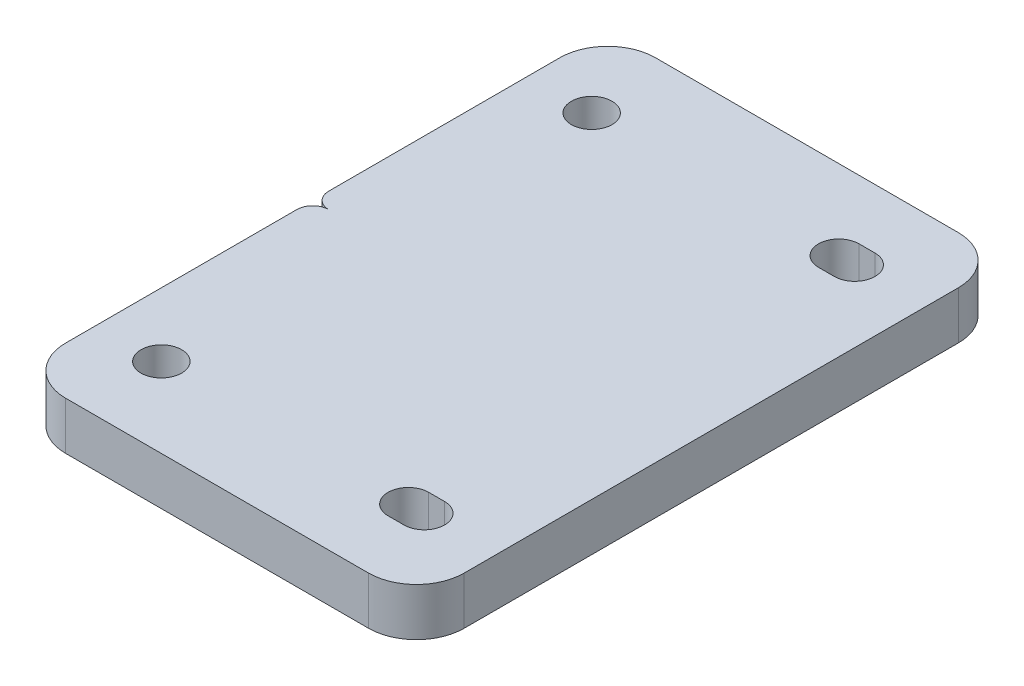
ISO-10303-21;
HEADER;
FILE_DESCRIPTION(('STEP AP214'),'2;1');
FILE_NAME('part.step','',(''),(''),'','','');
FILE_SCHEMA(('AUTOMOTIVE_DESIGN { 1 0 10303 214 1 1 1 1 }'));
ENDSEC;
DATA;
#1=APPLICATION_CONTEXT('core data for automotive mechanical design processes');
#2=APPLICATION_PROTOCOL_DEFINITION('international standard','automotive_design',2000,#1);
#3=PRODUCT_CONTEXT('',#1,'mechanical');
#4=PRODUCT('Part','Part','',(#3));
#5=PRODUCT_RELATED_PRODUCT_CATEGORY('part','',(#4));
#6=PRODUCT_DEFINITION_FORMATION('','',#4);
#7=PRODUCT_DEFINITION_CONTEXT('part definition',#1,'design');
#8=PRODUCT_DEFINITION('design','',#6,#7);
#9=PRODUCT_DEFINITION_SHAPE('','',#8);
#10=(LENGTH_UNIT() NAMED_UNIT(*) SI_UNIT(.MILLI.,.METRE.));
#11=(NAMED_UNIT(*) PLANE_ANGLE_UNIT() SI_UNIT($,.RADIAN.));
#12=(NAMED_UNIT(*) SI_UNIT($,.STERADIAN.) SOLID_ANGLE_UNIT());
#13=UNCERTAINTY_MEASURE_WITH_UNIT(LENGTH_MEASURE(1.E-05),#10,'distance_accuracy_value','');
#14=(GEOMETRIC_REPRESENTATION_CONTEXT(3) GLOBAL_UNCERTAINTY_ASSIGNED_CONTEXT((#13)) GLOBAL_UNIT_ASSIGNED_CONTEXT((#10,
#11,#12)) REPRESENTATION_CONTEXT('',''));
#15=CARTESIAN_POINT('',(0.,0.,0.));
#16=DIRECTION('',(0.,0.,1.));
#17=DIRECTION('',(1.,0.,0.));
#18=AXIS2_PLACEMENT_3D('',#15,#16,#17);
#19=CARTESIAN_POINT('',(-25.,6.,31.));
#20=DIRECTION('',(1.,0.,0.));
#21=DIRECTION('',(0.,0.,-1.));
#22=AXIS2_PLACEMENT_3D('',#19,#20,#21);
#23=PLANE('',#22);
#24=DIRECTION('',(0.,-1.,0.));
#25=VECTOR('',#24,1.);
#26=CARTESIAN_POINT('',(-25.,6.,2.));
#27=LINE('',#26,#25);
#28=CARTESIAN_POINT('',(-25.,6.,2.));
#29=VERTEX_POINT('',#28);
#30=CARTESIAN_POINT('',(-25.,0.,2.));
#31=VERTEX_POINT('',#30);
#32=EDGE_CURVE('E165',#29,#31,#27,.T.);
#33=ORIENTED_EDGE('',*,*,#32,.T.);
#34=DIRECTION('',(0.,0.,1.));
#35=VECTOR('',#34,1.);
#36=CARTESIAN_POINT('',(-25.,0.,31.));
#37=LINE('',#36,#35);
#38=CARTESIAN_POINT('',(-25.,0.,31.));
#39=VERTEX_POINT('',#38);
#40=EDGE_CURVE('E211',#31,#39,#37,.T.);
#41=ORIENTED_EDGE('',*,*,#40,.T.);
#42=DIRECTION('',(0.,-1.,0.));
#43=VECTOR('',#42,1.);
#44=CARTESIAN_POINT('',(-25.,6.,31.));
#45=LINE('',#44,#43);
#46=CARTESIAN_POINT('',(-25.,6.,31.));
#47=VERTEX_POINT('',#46);
#48=EDGE_CURVE('E185',#47,#39,#45,.T.);
#49=ORIENTED_EDGE('',*,*,#48,.F.);
#50=DIRECTION('',(0.,0.,1.));
#51=VECTOR('',#50,1.);
#52=CARTESIAN_POINT('',(-25.,6.,31.));
#53=LINE('',#52,#51);
#54=EDGE_CURVE('E179',#29,#47,#53,.T.);
#55=ORIENTED_EDGE('',*,*,#54,.F.);
#56=EDGE_LOOP('',(#33,#41,#49,#55));
#57=FACE_BOUND('',#56,.T.);
#58=ADVANCED_FACE('F33',(#57),#23,.F.);
#59=CARTESIAN_POINT('',(19.,6.,-31.));
#60=DIRECTION('',(0.,-1.,0.));
#61=DIRECTION('',(0.,0.,-1.));
#62=AXIS2_PLACEMENT_3D('',#59,#60,#61);
#63=CYLINDRICAL_SURFACE('',#62,6.);
#64=CARTESIAN_POINT('',(19.,0.,-31.));
#65=DIRECTION('',(0.,1.,0.));
#66=DIRECTION('',(0.,0.,-1.));
#67=AXIS2_PLACEMENT_3D('',#64,#65,#66);
#68=CIRCLE('',#67,6.);
#69=CARTESIAN_POINT('',(25.,0.,-31.));
#70=VERTEX_POINT('',#69);
#71=CARTESIAN_POINT('',(19.,0.,-37.));
#72=VERTEX_POINT('',#71);
#73=EDGE_CURVE('E203',#70,#72,#68,.T.);
#74=ORIENTED_EDGE('',*,*,#73,.T.);
#75=DIRECTION('',(0.,-1.,0.));
#76=VECTOR('',#75,1.);
#77=CARTESIAN_POINT('',(19.,6.,-37.));
#78=LINE('',#77,#76);
#79=CARTESIAN_POINT('',(19.,6.,-37.));
#80=VERTEX_POINT('',#79);
#81=EDGE_CURVE('E11',#80,#72,#78,.T.);
#82=ORIENTED_EDGE('',*,*,#81,.F.);
#83=CARTESIAN_POINT('',(19.,6.,-31.));
#84=DIRECTION('',(0.,1.,0.));
#85=DIRECTION('',(0.,0.,-1.));
#86=AXIS2_PLACEMENT_3D('',#83,#84,#85);
#87=CIRCLE('',#86,6.);
#88=CARTESIAN_POINT('',(25.,6.,-31.));
#89=VERTEX_POINT('',#88);
#90=EDGE_CURVE('E223',#89,#80,#87,.T.);
#91=ORIENTED_EDGE('',*,*,#90,.F.);
#92=DIRECTION('',(0.,-1.,0.));
#93=VECTOR('',#92,1.);
#94=CARTESIAN_POINT('',(25.,6.,-31.));
#95=LINE('',#94,#93);
#96=EDGE_CURVE('E202',#89,#70,#95,.T.);
#97=ORIENTED_EDGE('',*,*,#96,.T.);
#98=EDGE_LOOP('',(#74,#82,#91,#97));
#99=FACE_BOUND('',#98,.T.);
#100=ADVANCED_FACE('F35',(#99),#63,.T.);
#101=CARTESIAN_POINT('',(-19.,6.,-37.));
#102=DIRECTION('',(0.,0.,1.));
#103=DIRECTION('',(1.,0.,0.));
#104=AXIS2_PLACEMENT_3D('',#101,#102,#103);
#105=PLANE('',#104);
#106=DIRECTION('',(-1.,0.,0.));
#107=VECTOR('',#106,1.);
#108=CARTESIAN_POINT('',(-19.,0.,-37.));
#109=LINE('',#108,#107);
#110=CARTESIAN_POINT('',(-19.,0.,-37.));
#111=VERTEX_POINT('',#110);
#112=EDGE_CURVE('E206',#72,#111,#109,.T.);
#113=ORIENTED_EDGE('',*,*,#112,.T.);
#114=DIRECTION('',(0.,-1.,0.));
#115=VECTOR('',#114,1.);
#116=CARTESIAN_POINT('',(-19.,6.,-37.));
#117=LINE('',#116,#115);
#118=CARTESIAN_POINT('',(-19.,6.,-37.));
#119=VERTEX_POINT('',#118);
#120=EDGE_CURVE('E41',#119,#111,#117,.T.);
#121=ORIENTED_EDGE('',*,*,#120,.F.);
#122=DIRECTION('',(-1.,0.,0.));
#123=VECTOR('',#122,1.);
#124=CARTESIAN_POINT('',(-19.,6.,-37.));
#125=LINE('',#124,#123);
#126=EDGE_CURVE('E191',#80,#119,#125,.T.);
#127=ORIENTED_EDGE('',*,*,#126,.F.);
#128=ORIENTED_EDGE('',*,*,#81,.T.);
#129=EDGE_LOOP('',(#113,#121,#127,#128));
#130=FACE_BOUND('',#129,.T.);
#131=ADVANCED_FACE('F358',(#130),#105,.F.);
#132=CARTESIAN_POINT('',(-19.,6.,-31.));
#133=DIRECTION('',(0.,-1.,0.));
#134=DIRECTION('',(0.,0.,-1.));
#135=AXIS2_PLACEMENT_3D('',#132,#133,#134);
#136=CYLINDRICAL_SURFACE('',#135,6.);
#137=CARTESIAN_POINT('',(-19.,0.,-31.));
#138=DIRECTION('',(0.,1.,0.));
#139=DIRECTION('',(0.,0.,-1.));
#140=AXIS2_PLACEMENT_3D('',#137,#138,#139);
#141=CIRCLE('',#140,6.);
#142=CARTESIAN_POINT('',(-25.,0.,-31.));
#143=VERTEX_POINT('',#142);
#144=EDGE_CURVE('E209',#111,#143,#141,.T.);
#145=ORIENTED_EDGE('',*,*,#144,.T.);
#146=DIRECTION('',(0.,-1.,0.));
#147=VECTOR('',#146,1.);
#148=CARTESIAN_POINT('',(-25.,6.,-31.));
#149=LINE('',#148,#147);
#150=CARTESIAN_POINT('',(-25.,6.,-31.));
#151=VERTEX_POINT('',#150);
#152=EDGE_CURVE('E236',#151,#143,#149,.T.);
#153=ORIENTED_EDGE('',*,*,#152,.F.);
#154=CARTESIAN_POINT('',(-19.,6.,-31.));
#155=DIRECTION('',(0.,1.,0.));
#156=DIRECTION('',(0.,0.,-1.));
#157=AXIS2_PLACEMENT_3D('',#154,#155,#156);
#158=CIRCLE('',#157,6.);
#159=EDGE_CURVE('E188',#119,#151,#158,.T.);
#160=ORIENTED_EDGE('',*,*,#159,.F.);
#161=ORIENTED_EDGE('',*,*,#120,.T.);
#162=EDGE_LOOP('',(#145,#153,#160,#161));
#163=FACE_BOUND('',#162,.T.);
#164=ADVANCED_FACE('F243',(#163),#136,.T.);
#165=CARTESIAN_POINT('',(-25.,0.,-2.));
#166=VERTEX_POINT('',#165);
#167=EDGE_CURVE('E212',#143,#166,#37,.T.);
#168=ORIENTED_EDGE('',*,*,#167,.T.);
#169=DIRECTION('',(0.,-1.,0.));
#170=VECTOR('',#169,1.);
#171=CARTESIAN_POINT('',(-25.,6.,-2.));
#172=LINE('',#171,#170);
#173=CARTESIAN_POINT('',(-25.,6.,-2.));
#174=VERTEX_POINT('',#173);
#175=EDGE_CURVE('E48',#174,#166,#172,.T.);
#176=ORIENTED_EDGE('',*,*,#175,.F.);
#177=EDGE_CURVE('E187',#151,#174,#53,.T.);
#178=ORIENTED_EDGE('',*,*,#177,.F.);
#179=ORIENTED_EDGE('',*,*,#152,.T.);
#180=EDGE_LOOP('',(#168,#176,#178,#179));
#181=FACE_BOUND('',#180,.T.);
#182=ADVANCED_FACE('F252',(#181),#23,.F.);
#183=CARTESIAN_POINT('',(-19.,6.,31.));
#184=DIRECTION('',(0.,-1.,0.));
#185=DIRECTION('',(0.,0.,-1.));
#186=AXIS2_PLACEMENT_3D('',#183,#184,#185);
#187=CYLINDRICAL_SURFACE('',#186,6.);
#188=CARTESIAN_POINT('',(-19.,0.,31.));
#189=DIRECTION('',(0.,1.,0.));
#190=DIRECTION('',(0.,0.,-1.));
#191=AXIS2_PLACEMENT_3D('',#188,#189,#190);
#192=CIRCLE('',#191,6.);
#193=CARTESIAN_POINT('',(-19.,0.,37.));
#194=VERTEX_POINT('',#193);
#195=EDGE_CURVE('E215',#39,#194,#192,.T.);
#196=ORIENTED_EDGE('',*,*,#195,.T.);
#197=DIRECTION('',(0.,-1.,0.));
#198=VECTOR('',#197,1.);
#199=CARTESIAN_POINT('',(-19.,6.,37.));
#200=LINE('',#199,#198);
#201=CARTESIAN_POINT('',(-19.,6.,37.));
#202=VERTEX_POINT('',#201);
#203=EDGE_CURVE('E232',#202,#194,#200,.T.);
#204=ORIENTED_EDGE('',*,*,#203,.F.);
#205=CARTESIAN_POINT('',(-19.,6.,31.));
#206=DIRECTION('',(0.,1.,0.));
#207=DIRECTION('',(0.,0.,-1.));
#208=AXIS2_PLACEMENT_3D('',#205,#206,#207);
#209=CIRCLE('',#208,6.);
#210=EDGE_CURVE('E190',#47,#202,#209,.T.);
#211=ORIENTED_EDGE('',*,*,#210,.F.);
#212=ORIENTED_EDGE('',*,*,#48,.T.);
#213=EDGE_LOOP('',(#196,#204,#211,#212));
#214=FACE_BOUND('',#213,.T.);
#215=ADVANCED_FACE('F341',(#214),#187,.T.);
#216=CARTESIAN_POINT('',(-19.,6.,37.));
#217=DIRECTION('',(0.,0.,-1.));
#218=DIRECTION('',(-1.,0.,0.));
#219=AXIS2_PLACEMENT_3D('',#216,#217,#218);
#220=PLANE('',#219);
#221=DIRECTION('',(1.,0.,0.));
#222=VECTOR('',#221,1.);
#223=CARTESIAN_POINT('',(-19.,0.,37.));
#224=LINE('',#223,#222);
#225=CARTESIAN_POINT('',(19.,0.,37.));
#226=VERTEX_POINT('',#225);
#227=EDGE_CURVE('E217',#194,#226,#224,.T.);
#228=ORIENTED_EDGE('',*,*,#227,.T.);
#229=DIRECTION('',(0.,-1.,0.));
#230=VECTOR('',#229,1.);
#231=CARTESIAN_POINT('',(19.,6.,37.));
#232=LINE('',#231,#230);
#233=CARTESIAN_POINT('',(19.,6.,37.));
#234=VERTEX_POINT('',#233);
#235=EDGE_CURVE('E229',#234,#226,#232,.T.);
#236=ORIENTED_EDGE('',*,*,#235,.F.);
#237=DIRECTION('',(1.,0.,0.));
#238=VECTOR('',#237,1.);
#239=CARTESIAN_POINT('',(-19.,6.,37.));
#240=LINE('',#239,#238);
#241=EDGE_CURVE('E196',#202,#234,#240,.T.);
#242=ORIENTED_EDGE('',*,*,#241,.F.);
#243=ORIENTED_EDGE('',*,*,#203,.T.);
#244=EDGE_LOOP('',(#228,#236,#242,#243));
#245=FACE_BOUND('',#244,.T.);
#246=ADVANCED_FACE('F348',(#245),#220,.F.);
#247=CARTESIAN_POINT('',(19.,6.,31.));
#248=DIRECTION('',(0.,-1.,0.));
#249=DIRECTION('',(0.,0.,-1.));
#250=AXIS2_PLACEMENT_3D('',#247,#248,#249);
#251=CYLINDRICAL_SURFACE('',#250,6.);
#252=CARTESIAN_POINT('',(19.,0.,31.));
#253=DIRECTION('',(0.,1.,0.));
#254=DIRECTION('',(0.,0.,1.));
#255=AXIS2_PLACEMENT_3D('',#252,#253,#254);
#256=CIRCLE('',#255,6.);
#257=CARTESIAN_POINT('',(25.,0.,31.));
#258=VERTEX_POINT('',#257);
#259=EDGE_CURVE('E219',#226,#258,#256,.T.);
#260=ORIENTED_EDGE('',*,*,#259,.T.);
#261=DIRECTION('',(0.,-1.,0.));
#262=VECTOR('',#261,1.);
#263=CARTESIAN_POINT('',(25.,6.,31.));
#264=LINE('',#263,#262);
#265=CARTESIAN_POINT('',(25.,6.,31.));
#266=VERTEX_POINT('',#265);
#267=EDGE_CURVE('E226',#266,#258,#264,.T.);
#268=ORIENTED_EDGE('',*,*,#267,.F.);
#269=CARTESIAN_POINT('',(19.,6.,31.));
#270=DIRECTION('',(0.,1.,0.));
#271=DIRECTION('',(0.,0.,1.));
#272=AXIS2_PLACEMENT_3D('',#269,#270,#271);
#273=CIRCLE('',#272,6.);
#274=EDGE_CURVE('E198',#234,#266,#273,.T.);
#275=ORIENTED_EDGE('',*,*,#274,.F.);
#276=ORIENTED_EDGE('',*,*,#235,.T.);
#277=EDGE_LOOP('',(#260,#268,#275,#276));
#278=FACE_BOUND('',#277,.T.);
#279=ADVANCED_FACE('F351',(#278),#251,.T.);
#280=CARTESIAN_POINT('',(25.,6.,31.));
#281=DIRECTION('',(-1.,0.,0.));
#282=DIRECTION('',(0.,0.,1.));
#283=AXIS2_PLACEMENT_3D('',#280,#281,#282);
#284=PLANE('',#283);
#285=DIRECTION('',(0.,0.,-1.));
#286=VECTOR('',#285,1.);
#287=CARTESIAN_POINT('',(25.,0.,31.));
#288=LINE('',#287,#286);
#289=EDGE_CURVE('E221',#258,#70,#288,.T.);
#290=ORIENTED_EDGE('',*,*,#289,.T.);
#291=ORIENTED_EDGE('',*,*,#96,.F.);
#292=DIRECTION('',(0.,0.,-1.));
#293=VECTOR('',#292,1.);
#294=CARTESIAN_POINT('',(25.,6.,31.));
#295=LINE('',#294,#293);
#296=EDGE_CURVE('E200',#266,#89,#295,.T.);
#297=ORIENTED_EDGE('',*,*,#296,.F.);
#298=ORIENTED_EDGE('',*,*,#267,.T.);
#299=EDGE_LOOP('',(#290,#291,#297,#298));
#300=FACE_BOUND('',#299,.T.);
#301=ADVANCED_FACE('F356',(#300),#284,.F.);
#302=CARTESIAN_POINT('',(19.,6.,-31.));
#303=DIRECTION('',(0.,-1.,0.));
#304=DIRECTION('',(0.,0.,-1.));
#305=AXIS2_PLACEMENT_3D('',#302,#303,#304);
#306=PLANE('',#305);
#307=CARTESIAN_POINT('',(-17.,6.,27.));
#308=DIRECTION('',(0.,-1.,0.));
#309=DIRECTION('',(0.,0.,1.));
#310=AXIS2_PLACEMENT_3D('',#307,#308,#309);
#311=CIRCLE('',#310,2.55);
#312=CARTESIAN_POINT('',(-17.,6.,29.55));
#313=VERTEX_POINT('',#312);
#314=EDGE_CURVE('E268',#313,#313,#311,.T.);
#315=ORIENTED_EDGE('',*,*,#314,.T.);
#316=EDGE_LOOP('',(#315));
#317=FACE_BOUND('',#316,.T.);
#318=DIRECTION('',(1.,0.,0.));
#319=VECTOR('',#318,1.);
#320=CARTESIAN_POINT('',(16.,6.,24.45));
#321=LINE('',#320,#319);
#322=CARTESIAN_POINT('',(14.,6.,24.45));
#323=VERTEX_POINT('',#322);
#324=CARTESIAN_POINT('',(16.,6.,24.45));
#325=VERTEX_POINT('',#324);
#326=EDGE_CURVE('E277',#323,#325,#321,.T.);
#327=ORIENTED_EDGE('',*,*,#326,.T.);
#328=CARTESIAN_POINT('',(16.,6.,27.));
#329=DIRECTION('',(0.,-1.,0.));
#330=DIRECTION('',(0.,0.,1.));
#331=AXIS2_PLACEMENT_3D('',#328,#329,#330);
#332=CIRCLE('',#331,2.55);
#333=CARTESIAN_POINT('',(16.,6.,29.55));
#334=VERTEX_POINT('',#333);
#335=EDGE_CURVE('E287',#325,#334,#332,.T.);
#336=ORIENTED_EDGE('',*,*,#335,.T.);
#337=DIRECTION('',(-1.,0.,0.));
#338=VECTOR('',#337,1.);
#339=CARTESIAN_POINT('',(16.,6.,29.55));
#340=LINE('',#339,#338);
#341=CARTESIAN_POINT('',(14.,6.,29.55));
#342=VERTEX_POINT('',#341);
#343=EDGE_CURVE('E298',#334,#342,#340,.T.);
#344=ORIENTED_EDGE('',*,*,#343,.T.);
#345=CARTESIAN_POINT('',(14.,6.,27.));
#346=DIRECTION('',(0.,-1.,0.));
#347=DIRECTION('',(0.,0.,1.));
#348=AXIS2_PLACEMENT_3D('',#345,#346,#347);
#349=CIRCLE('',#348,2.55);
#350=EDGE_CURVE('E56',#342,#323,#349,.T.);
#351=ORIENTED_EDGE('',*,*,#350,.T.);
#352=EDGE_LOOP('',(#327,#336,#344,#351));
#353=FACE_BOUND('',#352,.T.);
#354=DIRECTION('',(1.,0.,0.));
#355=VECTOR('',#354,1.);
#356=CARTESIAN_POINT('',(16.,6.,-29.55));
#357=LINE('',#356,#355);
#358=CARTESIAN_POINT('',(14.,6.,-29.55));
#359=VERTEX_POINT('',#358);
#360=CARTESIAN_POINT('',(16.,6.,-29.55));
#361=VERTEX_POINT('',#360);
#362=EDGE_CURVE('E307',#359,#361,#357,.T.);
#363=ORIENTED_EDGE('',*,*,#362,.T.);
#364=CARTESIAN_POINT('',(16.,6.,-27.));
#365=DIRECTION('',(0.,-1.,0.));
#366=DIRECTION('',(0.,0.,-1.));
#367=AXIS2_PLACEMENT_3D('',#364,#365,#366);
#368=CIRCLE('',#367,2.55);
#369=CARTESIAN_POINT('',(16.,6.,-24.45));
#370=VERTEX_POINT('',#369);
#371=EDGE_CURVE('E315',#361,#370,#368,.T.);
#372=ORIENTED_EDGE('',*,*,#371,.T.);
#373=DIRECTION('',(-1.,0.,0.));
#374=VECTOR('',#373,1.);
#375=CARTESIAN_POINT('',(16.,6.,-24.45));
#376=LINE('',#375,#374);
#377=CARTESIAN_POINT('',(14.,6.,-24.45));
#378=VERTEX_POINT('',#377);
#379=EDGE_CURVE('E328',#370,#378,#376,.T.);
#380=ORIENTED_EDGE('',*,*,#379,.T.);
#381=CARTESIAN_POINT('',(14.,6.,-27.));
#382=DIRECTION('',(0.,-1.,0.));
#383=DIRECTION('',(0.,0.,-1.));
#384=AXIS2_PLACEMENT_3D('',#381,#382,#383);
#385=CIRCLE('',#384,2.55);
#386=EDGE_CURVE('E325',#378,#359,#385,.T.);
#387=ORIENTED_EDGE('',*,*,#386,.T.);
#388=EDGE_LOOP('',(#363,#372,#380,#387));
#389=FACE_BOUND('',#388,.T.);
#390=CARTESIAN_POINT('',(-17.,6.,-27.));
#391=DIRECTION('',(0.,-1.,0.));
#392=DIRECTION('',(0.,0.,-1.));
#393=AXIS2_PLACEMENT_3D('',#390,#391,#392);
#394=CIRCLE('',#393,2.55);
#395=CARTESIAN_POINT('',(-17.,6.,-29.55));
#396=VERTEX_POINT('',#395);
#397=EDGE_CURVE('E207',#396,#396,#394,.T.);
#398=ORIENTED_EDGE('',*,*,#397,.T.);
#399=EDGE_LOOP('',(#398));
#400=FACE_BOUND('',#399,.T.);
#401=CARTESIAN_POINT('',(-23.,6.,-2.));
#402=DIRECTION('',(0.,1.,0.));
#403=DIRECTION('',(0.,0.,-1.));
#404=AXIS2_PLACEMENT_3D('',#401,#402,#403);
#405=CIRCLE('',#404,2.);
#406=CARTESIAN_POINT('',(-23.,6.,0.));
#407=VERTEX_POINT('',#406);
#408=EDGE_CURVE('E175',#174,#407,#405,.T.);
#409=ORIENTED_EDGE('',*,*,#408,.T.);
#410=CARTESIAN_POINT('',(-23.,6.,2.));
#411=DIRECTION('',(0.,1.,0.));
#412=DIRECTION('',(0.,0.,1.));
#413=AXIS2_PLACEMENT_3D('',#410,#411,#412);
#414=CIRCLE('',#413,2.);
#415=EDGE_CURVE('E168',#407,#29,#414,.T.);
#416=ORIENTED_EDGE('',*,*,#415,.T.);
#417=ORIENTED_EDGE('',*,*,#54,.T.);
#418=ORIENTED_EDGE('',*,*,#210,.T.);
#419=ORIENTED_EDGE('',*,*,#241,.T.);
#420=ORIENTED_EDGE('',*,*,#274,.T.);
#421=ORIENTED_EDGE('',*,*,#296,.T.);
#422=ORIENTED_EDGE('',*,*,#90,.T.);
#423=ORIENTED_EDGE('',*,*,#126,.T.);
#424=ORIENTED_EDGE('',*,*,#159,.T.);
#425=ORIENTED_EDGE('',*,*,#177,.T.);
#426=EDGE_LOOP('',(#409,#416,#417,#418,#419,#420,#421,#422,#423,#424,#425));
#427=FACE_BOUND('',#426,.T.);
#428=ADVANCED_FACE('F178',(#317,#353,#389,#400,#427),#306,.F.);
#429=CARTESIAN_POINT('',(19.,0.,-31.));
#430=DIRECTION('',(0.,-1.,0.));
#431=DIRECTION('',(0.,0.,-1.));
#432=AXIS2_PLACEMENT_3D('',#429,#430,#431);
#433=PLANE('',#432);
#434=CARTESIAN_POINT('',(-23.,0.,2.));
#435=DIRECTION('',(0.,1.,0.));
#436=DIRECTION('',(0.,0.,1.));
#437=AXIS2_PLACEMENT_3D('',#434,#435,#436);
#438=CIRCLE('',#437,2.);
#439=CARTESIAN_POINT('',(-23.,0.,0.));
#440=VERTEX_POINT('',#439);
#441=EDGE_CURVE('E171',#440,#31,#438,.T.);
#442=ORIENTED_EDGE('',*,*,#441,.F.);
#443=CARTESIAN_POINT('',(-23.,0.,-2.));
#444=DIRECTION('',(0.,1.,0.));
#445=DIRECTION('',(0.,0.,-1.));
#446=AXIS2_PLACEMENT_3D('',#443,#444,#445);
#447=CIRCLE('',#446,2.);
#448=EDGE_CURVE('E182',#166,#440,#447,.T.);
#449=ORIENTED_EDGE('',*,*,#448,.F.);
#450=ORIENTED_EDGE('',*,*,#167,.F.);
#451=ORIENTED_EDGE('',*,*,#144,.F.);
#452=ORIENTED_EDGE('',*,*,#112,.F.);
#453=ORIENTED_EDGE('',*,*,#73,.F.);
#454=ORIENTED_EDGE('',*,*,#289,.F.);
#455=ORIENTED_EDGE('',*,*,#259,.F.);
#456=ORIENTED_EDGE('',*,*,#227,.F.);
#457=ORIENTED_EDGE('',*,*,#195,.F.);
#458=ORIENTED_EDGE('',*,*,#40,.F.);
#459=EDGE_LOOP('',(#442,#449,#450,#451,#452,#453,#454,#455,#456,#457,#458));
#460=FACE_BOUND('',#459,.T.);
#461=CARTESIAN_POINT('',(-17.,0.,27.));
#462=DIRECTION('',(0.,-1.,0.));
#463=DIRECTION('',(0.,0.,1.));
#464=AXIS2_PLACEMENT_3D('',#461,#462,#463);
#465=CIRCLE('',#464,2.55);
#466=CARTESIAN_POINT('',(-17.,0.,29.55));
#467=VERTEX_POINT('',#466);
#468=EDGE_CURVE('E265',#467,#467,#465,.T.);
#469=ORIENTED_EDGE('',*,*,#468,.F.);
#470=EDGE_LOOP('',(#469));
#471=FACE_BOUND('',#470,.T.);
#472=CARTESIAN_POINT('',(16.,0.,27.));
#473=DIRECTION('',(0.,-1.,0.));
#474=DIRECTION('',(0.,0.,1.));
#475=AXIS2_PLACEMENT_3D('',#472,#473,#474);
#476=CIRCLE('',#475,2.55);
#477=CARTESIAN_POINT('',(16.,0.,24.45));
#478=VERTEX_POINT('',#477);
#479=CARTESIAN_POINT('',(16.,0.,29.55));
#480=VERTEX_POINT('',#479);
#481=EDGE_CURVE('E272',#478,#480,#476,.T.);
#482=ORIENTED_EDGE('',*,*,#481,.F.);
#483=DIRECTION('',(1.,0.,0.));
#484=VECTOR('',#483,1.);
#485=CARTESIAN_POINT('',(16.,0.,24.45));
#486=LINE('',#485,#484);
#487=CARTESIAN_POINT('',(14.,0.,24.45));
#488=VERTEX_POINT('',#487);
#489=EDGE_CURVE('E284',#488,#478,#486,.T.);
#490=ORIENTED_EDGE('',*,*,#489,.F.);
#491=CARTESIAN_POINT('',(14.,0.,27.));
#492=DIRECTION('',(0.,-1.,0.));
#493=DIRECTION('',(0.,0.,1.));
#494=AXIS2_PLACEMENT_3D('',#491,#492,#493);
#495=CIRCLE('',#494,2.55);
#496=CARTESIAN_POINT('',(14.,0.,29.55));
#497=VERTEX_POINT('',#496);
#498=EDGE_CURVE('E288',#497,#488,#495,.T.);
#499=ORIENTED_EDGE('',*,*,#498,.F.);
#500=DIRECTION('',(-1.,0.,0.));
#501=VECTOR('',#500,1.);
#502=CARTESIAN_POINT('',(16.,0.,29.55));
#503=LINE('',#502,#501);
#504=EDGE_CURVE('E291',#480,#497,#503,.T.);
#505=ORIENTED_EDGE('',*,*,#504,.F.);
#506=EDGE_LOOP('',(#482,#490,#499,#505));
#507=FACE_BOUND('',#506,.T.);
#508=CARTESIAN_POINT('',(16.,0.,-27.));
#509=DIRECTION('',(0.,-1.,0.));
#510=DIRECTION('',(0.,0.,-1.));
#511=AXIS2_PLACEMENT_3D('',#508,#509,#510);
#512=CIRCLE('',#511,2.55);
#513=CARTESIAN_POINT('',(16.,0.,-29.55));
#514=VERTEX_POINT('',#513);
#515=CARTESIAN_POINT('',(16.,0.,-24.45));
#516=VERTEX_POINT('',#515);
#517=EDGE_CURVE('E283',#514,#516,#512,.T.);
#518=ORIENTED_EDGE('',*,*,#517,.F.);
#519=DIRECTION('',(1.,0.,0.));
#520=VECTOR('',#519,1.);
#521=CARTESIAN_POINT('',(16.,0.,-29.55));
#522=LINE('',#521,#520);
#523=CARTESIAN_POINT('',(14.,0.,-29.55));
#524=VERTEX_POINT('',#523);
#525=EDGE_CURVE('E312',#524,#514,#522,.T.);
#526=ORIENTED_EDGE('',*,*,#525,.F.);
#527=CARTESIAN_POINT('',(14.,0.,-27.));
#528=DIRECTION('',(0.,-1.,0.));
#529=DIRECTION('',(0.,0.,-1.));
#530=AXIS2_PLACEMENT_3D('',#527,#528,#529);
#531=CIRCLE('',#530,2.55);
#532=CARTESIAN_POINT('',(14.,0.,-24.45));
#533=VERTEX_POINT('',#532);
#534=EDGE_CURVE('E316',#533,#524,#531,.T.);
#535=ORIENTED_EDGE('',*,*,#534,.F.);
#536=DIRECTION('',(-1.,0.,0.));
#537=VECTOR('',#536,1.);
#538=CARTESIAN_POINT('',(16.,0.,-24.45));
#539=LINE('',#538,#537);
#540=EDGE_CURVE('E319',#516,#533,#539,.T.);
#541=ORIENTED_EDGE('',*,*,#540,.F.);
#542=EDGE_LOOP('',(#518,#526,#535,#541));
#543=FACE_BOUND('',#542,.T.);
#544=CARTESIAN_POINT('',(-17.,0.,-27.));
#545=DIRECTION('',(0.,-1.,0.));
#546=DIRECTION('',(0.,0.,-1.));
#547=AXIS2_PLACEMENT_3D('',#544,#545,#546);
#548=CIRCLE('',#547,2.55);
#549=CARTESIAN_POINT('',(-17.,0.,-29.55));
#550=VERTEX_POINT('',#549);
#551=EDGE_CURVE('E259',#550,#550,#548,.T.);
#552=ORIENTED_EDGE('',*,*,#551,.F.);
#553=EDGE_LOOP('',(#552));
#554=FACE_BOUND('',#553,.T.);
#555=ADVANCED_FACE('F248',(#460,#471,#507,#543,#554),#433,.T.);
#556=CARTESIAN_POINT('',(-17.,6.,-27.));
#557=DIRECTION('',(0.,-1.,0.));
#558=DIRECTION('',(0.,0.,-1.));
#559=AXIS2_PLACEMENT_3D('',#556,#557,#558);
#560=CYLINDRICAL_SURFACE('',#559,2.55);
#561=ORIENTED_EDGE('',*,*,#397,.F.);
#562=EDGE_LOOP('',(#561));
#563=FACE_BOUND('',#562,.T.);
#564=ORIENTED_EDGE('',*,*,#551,.T.);
#565=EDGE_LOOP('',(#564));
#566=FACE_BOUND('',#565,.T.);
#567=ADVANCED_FACE('F385',(#563,#566),#560,.F.);
#568=CARTESIAN_POINT('',(16.,6.,-27.));
#569=DIRECTION('',(0.,-1.,0.));
#570=DIRECTION('',(0.,0.,-1.));
#571=AXIS2_PLACEMENT_3D('',#568,#569,#570);
#572=CYLINDRICAL_SURFACE('',#571,2.55);
#573=ORIENTED_EDGE('',*,*,#517,.T.);
#574=DIRECTION('',(0.,-1.,0.));
#575=VECTOR('',#574,1.);
#576=CARTESIAN_POINT('',(16.,6.,-24.45));
#577=LINE('',#576,#575);
#578=EDGE_CURVE('E303',#370,#516,#577,.T.);
#579=ORIENTED_EDGE('',*,*,#578,.F.);
#580=ORIENTED_EDGE('',*,*,#371,.F.);
#581=DIRECTION('',(0.,-1.,0.));
#582=VECTOR('',#581,1.);
#583=CARTESIAN_POINT('',(16.,6.,-29.55));
#584=LINE('',#583,#582);
#585=EDGE_CURVE('E262',#361,#514,#584,.T.);
#586=ORIENTED_EDGE('',*,*,#585,.T.);
#587=EDGE_LOOP('',(#573,#579,#580,#586));
#588=FACE_BOUND('',#587,.T.);
#589=ADVANCED_FACE('F391',(#588),#572,.F.);
#590=CARTESIAN_POINT('',(16.,6.,-29.55));
#591=DIRECTION('',(0.,0.,-1.));
#592=DIRECTION('',(-1.,0.,0.));
#593=AXIS2_PLACEMENT_3D('',#590,#591,#592);
#594=PLANE('',#593);
#595=ORIENTED_EDGE('',*,*,#525,.T.);
#596=ORIENTED_EDGE('',*,*,#585,.F.);
#597=ORIENTED_EDGE('',*,*,#362,.F.);
#598=DIRECTION('',(0.,-1.,0.));
#599=VECTOR('',#598,1.);
#600=CARTESIAN_POINT('',(14.,6.,-29.55));
#601=LINE('',#600,#599);
#602=EDGE_CURVE('E309',#359,#524,#601,.T.);
#603=ORIENTED_EDGE('',*,*,#602,.T.);
#604=EDGE_LOOP('',(#595,#596,#597,#603));
#605=FACE_BOUND('',#604,.T.);
#606=ADVANCED_FACE('F415',(#605),#594,.F.);
#607=CARTESIAN_POINT('',(14.,6.,-27.));
#608=DIRECTION('',(0.,-1.,0.));
#609=DIRECTION('',(0.,0.,-1.));
#610=AXIS2_PLACEMENT_3D('',#607,#608,#609);
#611=CYLINDRICAL_SURFACE('',#610,2.55);
#612=ORIENTED_EDGE('',*,*,#534,.T.);
#613=ORIENTED_EDGE('',*,*,#602,.F.);
#614=ORIENTED_EDGE('',*,*,#386,.F.);
#615=DIRECTION('',(0.,-1.,0.));
#616=VECTOR('',#615,1.);
#617=CARTESIAN_POINT('',(14.,6.,-24.45));
#618=LINE('',#617,#616);
#619=EDGE_CURVE('E306',#378,#533,#618,.T.);
#620=ORIENTED_EDGE('',*,*,#619,.T.);
#621=EDGE_LOOP('',(#612,#613,#614,#620));
#622=FACE_BOUND('',#621,.T.);
#623=ADVANCED_FACE('F419',(#622),#611,.F.);
#624=CARTESIAN_POINT('',(16.,6.,-24.45));
#625=DIRECTION('',(0.,0.,1.));
#626=DIRECTION('',(1.,0.,0.));
#627=AXIS2_PLACEMENT_3D('',#624,#625,#626);
#628=PLANE('',#627);
#629=ORIENTED_EDGE('',*,*,#540,.T.);
#630=ORIENTED_EDGE('',*,*,#619,.F.);
#631=ORIENTED_EDGE('',*,*,#379,.F.);
#632=ORIENTED_EDGE('',*,*,#578,.T.);
#633=EDGE_LOOP('',(#629,#630,#631,#632));
#634=FACE_BOUND('',#633,.T.);
#635=ADVANCED_FACE('F402',(#634),#628,.F.);
#636=CARTESIAN_POINT('',(16.,6.,27.));
#637=DIRECTION('',(0.,-1.,0.));
#638=DIRECTION('',(0.,0.,-1.));
#639=AXIS2_PLACEMENT_3D('',#636,#637,#638);
#640=CYLINDRICAL_SURFACE('',#639,2.55);
#641=ORIENTED_EDGE('',*,*,#481,.T.);
#642=DIRECTION('',(0.,-1.,0.));
#643=VECTOR('',#642,1.);
#644=CARTESIAN_POINT('',(16.,6.,29.55));
#645=LINE('',#644,#643);
#646=EDGE_CURVE('E273',#334,#480,#645,.T.);
#647=ORIENTED_EDGE('',*,*,#646,.F.);
#648=ORIENTED_EDGE('',*,*,#335,.F.);
#649=DIRECTION('',(0.,-1.,0.));
#650=VECTOR('',#649,1.);
#651=CARTESIAN_POINT('',(16.,6.,24.45));
#652=LINE('',#651,#650);
#653=EDGE_CURVE('E281',#325,#478,#652,.T.);
#654=ORIENTED_EDGE('',*,*,#653,.T.);
#655=EDGE_LOOP('',(#641,#647,#648,#654));
#656=FACE_BOUND('',#655,.T.);
#657=ADVANCED_FACE('F398',(#656),#640,.F.);
#658=CARTESIAN_POINT('',(16.,6.,24.45));
#659=DIRECTION('',(0.,0.,-1.));
#660=DIRECTION('',(-1.,0.,0.));
#661=AXIS2_PLACEMENT_3D('',#658,#659,#660);
#662=PLANE('',#661);
#663=ORIENTED_EDGE('',*,*,#489,.T.);
#664=ORIENTED_EDGE('',*,*,#653,.F.);
#665=ORIENTED_EDGE('',*,*,#326,.F.);
#666=DIRECTION('',(0.,-1.,0.));
#667=VECTOR('',#666,1.);
#668=CARTESIAN_POINT('',(14.,6.,24.45));
#669=LINE('',#668,#667);
#670=EDGE_CURVE('E279',#323,#488,#669,.T.);
#671=ORIENTED_EDGE('',*,*,#670,.T.);
#672=EDGE_LOOP('',(#663,#664,#665,#671));
#673=FACE_BOUND('',#672,.T.);
#674=ADVANCED_FACE('F401',(#673),#662,.F.);
#675=CARTESIAN_POINT('',(14.,6.,27.));
#676=DIRECTION('',(0.,-1.,0.));
#677=DIRECTION('',(0.,0.,-1.));
#678=AXIS2_PLACEMENT_3D('',#675,#676,#677);
#679=CYLINDRICAL_SURFACE('',#678,2.55);
#680=ORIENTED_EDGE('',*,*,#498,.T.);
#681=ORIENTED_EDGE('',*,*,#670,.F.);
#682=ORIENTED_EDGE('',*,*,#350,.F.);
#683=DIRECTION('',(0.,-1.,0.));
#684=VECTOR('',#683,1.);
#685=CARTESIAN_POINT('',(14.,6.,29.55));
#686=LINE('',#685,#684);
#687=EDGE_CURVE('E276',#342,#497,#686,.T.);
#688=ORIENTED_EDGE('',*,*,#687,.T.);
#689=EDGE_LOOP('',(#680,#681,#682,#688));
#690=FACE_BOUND('',#689,.T.);
#691=ADVANCED_FACE('F406',(#690),#679,.F.);
#692=CARTESIAN_POINT('',(16.,6.,29.55));
#693=DIRECTION('',(0.,0.,1.));
#694=DIRECTION('',(1.,0.,0.));
#695=AXIS2_PLACEMENT_3D('',#692,#693,#694);
#696=PLANE('',#695);
#697=ORIENTED_EDGE('',*,*,#504,.T.);
#698=ORIENTED_EDGE('',*,*,#687,.F.);
#699=ORIENTED_EDGE('',*,*,#343,.F.);
#700=ORIENTED_EDGE('',*,*,#646,.T.);
#701=EDGE_LOOP('',(#697,#698,#699,#700));
#702=FACE_BOUND('',#701,.T.);
#703=ADVANCED_FACE('F396',(#702),#696,.F.);
#704=CARTESIAN_POINT('',(-17.,6.,27.));
#705=DIRECTION('',(0.,-1.,0.));
#706=DIRECTION('',(0.,0.,-1.));
#707=AXIS2_PLACEMENT_3D('',#704,#705,#706);
#708=CYLINDRICAL_SURFACE('',#707,2.55);
#709=ORIENTED_EDGE('',*,*,#314,.F.);
#710=EDGE_LOOP('',(#709));
#711=FACE_BOUND('',#710,.T.);
#712=ORIENTED_EDGE('',*,*,#468,.T.);
#713=EDGE_LOOP('',(#712));
#714=FACE_BOUND('',#713,.T.);
#715=ADVANCED_FACE('F393',(#711,#714),#708,.F.);
#716=CARTESIAN_POINT('',(-23.,6.,2.));
#717=DIRECTION('',(0.,-1.,0.));
#718=DIRECTION('',(0.,0.,-1.));
#719=AXIS2_PLACEMENT_3D('',#716,#717,#718);
#720=CYLINDRICAL_SURFACE('',#719,2.);
#721=ORIENTED_EDGE('',*,*,#441,.T.);
#722=ORIENTED_EDGE('',*,*,#32,.F.);
#723=ORIENTED_EDGE('',*,*,#415,.F.);
#724=DIRECTION('',(0.,-1.,0.));
#725=VECTOR('',#724,1.);
#726=CARTESIAN_POINT('',(-23.,6.,0.));
#727=LINE('',#726,#725);
#728=EDGE_CURVE('E269',#407,#440,#727,.T.);
#729=ORIENTED_EDGE('',*,*,#728,.T.);
#730=EDGE_LOOP('',(#721,#722,#723,#729));
#731=FACE_BOUND('',#730,.T.);
#732=ADVANCED_FACE('F167',(#731),#720,.T.);
#733=CARTESIAN_POINT('',(-23.,6.,-2.));
#734=DIRECTION('',(0.,-1.,0.));
#735=DIRECTION('',(0.,0.,-1.));
#736=AXIS2_PLACEMENT_3D('',#733,#734,#735);
#737=CYLINDRICAL_SURFACE('',#736,2.);
#738=ORIENTED_EDGE('',*,*,#448,.T.);
#739=ORIENTED_EDGE('',*,*,#728,.F.);
#740=ORIENTED_EDGE('',*,*,#408,.F.);
#741=ORIENTED_EDGE('',*,*,#175,.T.);
#742=EDGE_LOOP('',(#738,#739,#740,#741));
#743=FACE_BOUND('',#742,.T.);
#744=ADVANCED_FACE('F337',(#743),#737,.T.);
#745=CLOSED_SHELL('',(#58,#100,#131,#164,#182,#215,#246,#279,#301,#428,#555,#567,#589,#606,#623,
#635,#657,#674,#691,#703,#715,#732,#744));
#746=MANIFOLD_SOLID_BREP('B2',#745);
#747=ADVANCED_BREP_SHAPE_REPRESENTATION('',(#18,#746),#14);
#748=SHAPE_DEFINITION_REPRESENTATION(#9,#747);
ENDSEC;
END-ISO-10303-21;
